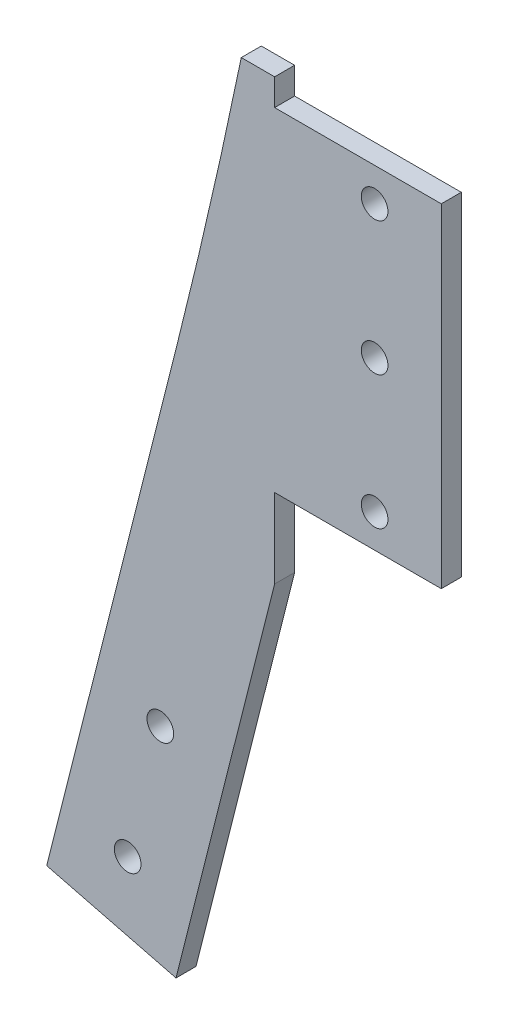
ISO-10303-21;
HEADER;
FILE_DESCRIPTION(('STEP AP214'),'2;1');
FILE_NAME('part.step','',(''),(''),'','','');
FILE_SCHEMA(('AUTOMOTIVE_DESIGN { 1 0 10303 214 1 1 1 1 }'));
ENDSEC;
DATA;
#1=APPLICATION_CONTEXT('core data for automotive mechanical design processes');
#2=APPLICATION_PROTOCOL_DEFINITION('international standard','automotive_design',2000,#1);
#3=PRODUCT_CONTEXT('',#1,'mechanical');
#4=PRODUCT('Part','Part','',(#3));
#5=PRODUCT_RELATED_PRODUCT_CATEGORY('part','',(#4));
#6=PRODUCT_DEFINITION_FORMATION('','',#4);
#7=PRODUCT_DEFINITION_CONTEXT('part definition',#1,'design');
#8=PRODUCT_DEFINITION('design','',#6,#7);
#9=PRODUCT_DEFINITION_SHAPE('','',#8);
#10=(LENGTH_UNIT() NAMED_UNIT(*) SI_UNIT(.MILLI.,.METRE.));
#11=(NAMED_UNIT(*) PLANE_ANGLE_UNIT() SI_UNIT($,.RADIAN.));
#12=(NAMED_UNIT(*) SI_UNIT($,.STERADIAN.) SOLID_ANGLE_UNIT());
#13=UNCERTAINTY_MEASURE_WITH_UNIT(LENGTH_MEASURE(1.E-05),#10,'distance_accuracy_value','');
#14=(GEOMETRIC_REPRESENTATION_CONTEXT(3) GLOBAL_UNCERTAINTY_ASSIGNED_CONTEXT((#13)) GLOBAL_UNIT_ASSIGNED_CONTEXT((#10,
#11,#12)) REPRESENTATION_CONTEXT('',''));
#15=CARTESIAN_POINT('',(0.,0.,0.));
#16=DIRECTION('',(0.,0.,1.));
#17=DIRECTION('',(1.,0.,0.));
#18=AXIS2_PLACEMENT_3D('',#15,#16,#17);
#19=CARTESIAN_POINT('',(-12.5150585075771,3.16036830999422,3.));
#20=DIRECTION('',(0.969563670871676,-0.244839310826181,0.));
#21=DIRECTION('',(0.244839310826181,0.969563670871677,0.));
#22=AXIS2_PLACEMENT_3D('',#19,#20,#21);
#23=PLANE('',#22);
#24=DIRECTION('',(-0.244839310826181,-0.969563670871677,0.));
#25=VECTOR('',#24,1.);
#26=CARTESIAN_POINT('',(-12.5150585075771,3.16036830999422,3.));
#27=LINE('',#26,#25);
#28=CARTESIAN_POINT('',(108.116259488817,480.860387575715,3.));
#29=VERTEX_POINT('',#28);
#30=CARTESIAN_POINT('',(88.8151541495192,404.428010432096,3.));
#31=VERTEX_POINT('',#30);
#32=EDGE_CURVE('E118',#29,#31,#27,.T.);
#33=ORIENTED_EDGE('',*,*,#32,.F.);
#34=DIRECTION('',(0.,0.,-1.));
#35=VECTOR('',#34,1.);
#36=CARTESIAN_POINT('',(108.116259488817,480.860387575715,3.));
#37=LINE('',#36,#35);
#38=CARTESIAN_POINT('',(108.116259488817,480.860387575715,0.));
#39=VERTEX_POINT('',#38);
#40=EDGE_CURVE('E134',#29,#39,#37,.T.);
#41=ORIENTED_EDGE('',*,*,#40,.T.);
#42=DIRECTION('',(-0.244839310826181,-0.969563670871677,0.));
#43=VECTOR('',#42,1.);
#44=CARTESIAN_POINT('',(-12.5150585075771,3.16036830999422,0.));
#45=LINE('',#44,#43);
#46=CARTESIAN_POINT('',(88.8151541495192,404.428010432096,0.));
#47=VERTEX_POINT('',#46);
#48=EDGE_CURVE('E131',#39,#47,#45,.T.);
#49=ORIENTED_EDGE('',*,*,#48,.T.);
#50=DIRECTION('',(0.,0.,-1.));
#51=VECTOR('',#50,1.);
#52=CARTESIAN_POINT('',(88.8151541495192,404.428010432096,3.));
#53=LINE('',#52,#51);
#54=EDGE_CURVE('E129',#31,#47,#53,.T.);
#55=ORIENTED_EDGE('',*,*,#54,.F.);
#56=EDGE_LOOP('',(#33,#41,#49,#55));
#57=FACE_BOUND('',#56,.T.);
#58=ADVANCED_FACE('F45',(#57),#23,.F.);
#59=CARTESIAN_POINT('',(101.330212657095,401.267642122102,3.));
#60=DIRECTION('',(0.244839310826178,0.969563670871677,0.));
#61=DIRECTION('',(-0.969563670871677,0.244839310826178,0.));
#62=AXIS2_PLACEMENT_3D('',#59,#60,#61);
#63=PLANE('',#62);
#64=DIRECTION('',(0.969563670871677,-0.244839310826178,0.));
#65=VECTOR('',#64,1.);
#66=CARTESIAN_POINT('',(101.330212657095,401.267642122102,0.));
#67=LINE('',#66,#65);
#68=CARTESIAN_POINT('',(108.206427566953,399.531224215573,0.));
#69=VERTEX_POINT('',#68);
#70=EDGE_CURVE('E176',#47,#69,#67,.T.);
#71=ORIENTED_EDGE('',*,*,#70,.T.);
#72=DIRECTION('',(0.,0.,-1.));
#73=VECTOR('',#72,1.);
#74=CARTESIAN_POINT('',(108.206427566953,399.531224215573,3.));
#75=LINE('',#74,#73);
#76=CARTESIAN_POINT('',(108.206427566953,399.531224215573,3.));
#77=VERTEX_POINT('',#76);
#78=EDGE_CURVE('E135',#77,#69,#75,.T.);
#79=ORIENTED_EDGE('',*,*,#78,.F.);
#80=DIRECTION('',(0.969563670871677,-0.244839310826178,0.));
#81=VECTOR('',#80,1.);
#82=CARTESIAN_POINT('',(101.330212657095,401.267642122102,3.));
#83=LINE('',#82,#81);
#84=EDGE_CURVE('E123',#31,#77,#83,.T.);
#85=ORIENTED_EDGE('',*,*,#84,.F.);
#86=ORIENTED_EDGE('',*,*,#54,.T.);
#87=EDGE_LOOP('',(#71,#79,#85,#86));
#88=FACE_BOUND('',#87,.T.);
#89=ADVANCED_FACE('F137',(#88),#63,.F.);
#90=CARTESIAN_POINT('',(6.8762149098565,-1.73641790652942,3.));
#91=DIRECTION('',(-0.969563670871677,0.24483931082618,0.));
#92=DIRECTION('',(-0.24483931082618,-0.969563670871677,0.));
#93=AXIS2_PLACEMENT_3D('',#90,#91,#92);
#94=PLANE('',#93);
#95=DIRECTION('',(0.24483931082618,0.969563670871677,0.));
#96=VECTOR('',#95,1.);
#97=CARTESIAN_POINT('',(6.8762149098565,-1.73641790652942,0.));
#98=LINE('',#97,#96);
#99=CARTESIAN_POINT('',(123.,458.113771050439,0.));
#100=VERTEX_POINT('',#99);
#101=EDGE_CURVE('E178',#69,#100,#98,.T.);
#102=ORIENTED_EDGE('',*,*,#101,.T.);
#103=DIRECTION('',(0.,0.,-1.));
#104=VECTOR('',#103,1.);
#105=CARTESIAN_POINT('',(123.,458.113771050439,3.));
#106=LINE('',#105,#104);
#107=CARTESIAN_POINT('',(123.,458.113771050439,3.));
#108=VERTEX_POINT('',#107);
#109=EDGE_CURVE('E224',#108,#100,#106,.T.);
#110=ORIENTED_EDGE('',*,*,#109,.F.);
#111=DIRECTION('',(0.24483931082618,0.969563670871677,0.));
#112=VECTOR('',#111,1.);
#113=CARTESIAN_POINT('',(6.8762149098565,-1.73641790652942,3.));
#114=LINE('',#113,#112);
#115=EDGE_CURVE('E140',#77,#108,#114,.T.);
#116=ORIENTED_EDGE('',*,*,#115,.F.);
#117=ORIENTED_EDGE('',*,*,#78,.T.);
#118=EDGE_LOOP('',(#102,#110,#116,#117));
#119=FACE_BOUND('',#118,.T.);
#120=ADVANCED_FACE('F246',(#119),#94,.F.);
#121=CARTESIAN_POINT('',(123.,0.,3.));
#122=DIRECTION('',(1.,0.,0.));
#123=DIRECTION('',(0.,0.,-1.));
#124=AXIS2_PLACEMENT_3D('',#121,#122,#123);
#125=PLANE('',#124);
#126=DIRECTION('',(0.,-1.,0.));
#127=VECTOR('',#126,1.);
#128=CARTESIAN_POINT('',(123.,0.,0.));
#129=LINE('',#128,#127);
#130=CARTESIAN_POINT('',(123.,470.,0.));
#131=VERTEX_POINT('',#130);
#132=EDGE_CURVE('E181',#131,#100,#129,.T.);
#133=ORIENTED_EDGE('',*,*,#132,.F.);
#134=DIRECTION('',(0.,0.,-1.));
#135=VECTOR('',#134,1.);
#136=CARTESIAN_POINT('',(123.,470.,3.));
#137=LINE('',#136,#135);
#138=CARTESIAN_POINT('',(123.,470.,3.));
#139=VERTEX_POINT('',#138);
#140=EDGE_CURVE('E222',#139,#131,#137,.T.);
#141=ORIENTED_EDGE('',*,*,#140,.F.);
#142=DIRECTION('',(0.,-1.,0.));
#143=VECTOR('',#142,1.);
#144=CARTESIAN_POINT('',(123.,0.,3.));
#145=LINE('',#144,#143);
#146=EDGE_CURVE('E142',#139,#108,#145,.T.);
#147=ORIENTED_EDGE('',*,*,#146,.T.);
#148=ORIENTED_EDGE('',*,*,#109,.T.);
#149=EDGE_LOOP('',(#133,#141,#147,#148));
#150=FACE_BOUND('',#149,.T.);
#151=ADVANCED_FACE('F251',(#150),#125,.T.);
#152=CARTESIAN_POINT('',(0.,470.,3.));
#153=DIRECTION('',(0.,-1.,0.));
#154=DIRECTION('',(0.,0.,-1.));
#155=AXIS2_PLACEMENT_3D('',#152,#153,#154);
#156=PLANE('',#155);
#157=DIRECTION('',(-1.,0.,0.));
#158=VECTOR('',#157,1.);
#159=CARTESIAN_POINT('',(0.,470.,0.));
#160=LINE('',#159,#158);
#161=CARTESIAN_POINT('',(148.,470.,0.));
#162=VERTEX_POINT('',#161);
#163=EDGE_CURVE('E184',#162,#131,#160,.T.);
#164=ORIENTED_EDGE('',*,*,#163,.F.);
#165=DIRECTION('',(0.,0.,-1.));
#166=VECTOR('',#165,1.);
#167=CARTESIAN_POINT('',(148.,470.,3.));
#168=LINE('',#167,#166);
#169=CARTESIAN_POINT('',(148.,470.,3.));
#170=VERTEX_POINT('',#169);
#171=EDGE_CURVE('E220',#170,#162,#168,.T.);
#172=ORIENTED_EDGE('',*,*,#171,.F.);
#173=DIRECTION('',(-1.,0.,0.));
#174=VECTOR('',#173,1.);
#175=CARTESIAN_POINT('',(0.,470.,3.));
#176=LINE('',#175,#174);
#177=EDGE_CURVE('E147',#170,#139,#176,.T.);
#178=ORIENTED_EDGE('',*,*,#177,.T.);
#179=ORIENTED_EDGE('',*,*,#140,.T.);
#180=EDGE_LOOP('',(#164,#172,#178,#179));
#181=FACE_BOUND('',#180,.T.);
#182=ADVANCED_FACE('F255',(#181),#156,.T.);
#183=CARTESIAN_POINT('',(148.,0.,3.));
#184=DIRECTION('',(-1.,0.,0.));
#185=DIRECTION('',(0.,-1.,0.));
#186=AXIS2_PLACEMENT_3D('',#183,#184,#185);
#187=PLANE('',#186);
#188=DIRECTION('',(0.,1.,0.));
#189=VECTOR('',#188,1.);
#190=CARTESIAN_POINT('',(148.,0.,0.));
#191=LINE('',#190,#189);
#192=CARTESIAN_POINT('',(148.,520.,0.));
#193=VERTEX_POINT('',#192);
#194=EDGE_CURVE('E187',#162,#193,#191,.T.);
#195=ORIENTED_EDGE('',*,*,#194,.T.);
#196=DIRECTION('',(0.,0.,-1.));
#197=VECTOR('',#196,1.);
#198=CARTESIAN_POINT('',(148.,520.,3.));
#199=LINE('',#198,#197);
#200=CARTESIAN_POINT('',(148.,520.,3.));
#201=VERTEX_POINT('',#200);
#202=EDGE_CURVE('E217',#201,#193,#199,.T.);
#203=ORIENTED_EDGE('',*,*,#202,.F.);
#204=DIRECTION('',(0.,1.,0.));
#205=VECTOR('',#204,1.);
#206=CARTESIAN_POINT('',(148.,0.,3.));
#207=LINE('',#206,#205);
#208=EDGE_CURVE('E150',#170,#201,#207,.T.);
#209=ORIENTED_EDGE('',*,*,#208,.F.);
#210=ORIENTED_EDGE('',*,*,#171,.T.);
#211=EDGE_LOOP('',(#195,#203,#209,#210));
#212=FACE_BOUND('',#211,.T.);
#213=ADVANCED_FACE('F259',(#212),#187,.F.);
#214=CARTESIAN_POINT('',(0.,520.,3.));
#215=DIRECTION('',(0.,-1.,0.));
#216=DIRECTION('',(0.,0.,-1.));
#217=AXIS2_PLACEMENT_3D('',#214,#215,#216);
#218=PLANE('',#217);
#219=DIRECTION('',(-1.,0.,0.));
#220=VECTOR('',#219,1.);
#221=CARTESIAN_POINT('',(0.,520.,0.));
#222=LINE('',#221,#220);
#223=CARTESIAN_POINT('',(123.,520.,0.));
#224=VERTEX_POINT('',#223);
#225=EDGE_CURVE('E189',#193,#224,#222,.T.);
#226=ORIENTED_EDGE('',*,*,#225,.T.);
#227=DIRECTION('',(0.,0.,-1.));
#228=VECTOR('',#227,1.);
#229=CARTESIAN_POINT('',(123.,520.,3.));
#230=LINE('',#229,#228);
#231=CARTESIAN_POINT('',(123.,520.,3.));
#232=VERTEX_POINT('',#231);
#233=EDGE_CURVE('E214',#232,#224,#230,.T.);
#234=ORIENTED_EDGE('',*,*,#233,.F.);
#235=DIRECTION('',(-1.,0.,0.));
#236=VECTOR('',#235,1.);
#237=CARTESIAN_POINT('',(0.,520.,3.));
#238=LINE('',#237,#236);
#239=EDGE_CURVE('E152',#201,#232,#238,.T.);
#240=ORIENTED_EDGE('',*,*,#239,.F.);
#241=ORIENTED_EDGE('',*,*,#202,.T.);
#242=EDGE_LOOP('',(#226,#234,#240,#241));
#243=FACE_BOUND('',#242,.T.);
#244=ADVANCED_FACE('F263',(#243),#218,.F.);
#245=CARTESIAN_POINT('',(123.,0.,3.));
#246=DIRECTION('',(-1.,0.,0.));
#247=DIRECTION('',(0.,0.,1.));
#248=AXIS2_PLACEMENT_3D('',#245,#246,#247);
#249=PLANE('',#248);
#250=DIRECTION('',(0.,1.,0.));
#251=VECTOR('',#250,1.);
#252=CARTESIAN_POINT('',(123.,0.,0.));
#253=LINE('',#252,#251);
#254=CARTESIAN_POINT('',(123.,524.,0.));
#255=VERTEX_POINT('',#254);
#256=EDGE_CURVE('E191',#224,#255,#253,.T.);
#257=ORIENTED_EDGE('',*,*,#256,.T.);
#258=DIRECTION('',(0.,0.,-1.));
#259=VECTOR('',#258,1.);
#260=CARTESIAN_POINT('',(123.,524.,3.));
#261=LINE('',#260,#259);
#262=CARTESIAN_POINT('',(123.,524.,3.));
#263=VERTEX_POINT('',#262);
#264=EDGE_CURVE('E212',#263,#255,#261,.T.);
#265=ORIENTED_EDGE('',*,*,#264,.F.);
#266=DIRECTION('',(0.,1.,0.));
#267=VECTOR('',#266,1.);
#268=CARTESIAN_POINT('',(123.,0.,3.));
#269=LINE('',#268,#267);
#270=EDGE_CURVE('E154',#232,#263,#269,.T.);
#271=ORIENTED_EDGE('',*,*,#270,.F.);
#272=ORIENTED_EDGE('',*,*,#233,.T.);
#273=EDGE_LOOP('',(#257,#265,#271,#272));
#274=FACE_BOUND('',#273,.T.);
#275=ADVANCED_FACE('F267',(#274),#249,.F.);
#276=CARTESIAN_POINT('',(105.855970183021,431.066527449985,3.));
#277=DIRECTION('',(0.,0.,-1.));
#278=DIRECTION('',(-1.,0.,0.));
#279=AXIS2_PLACEMENT_3D('',#276,#277,#278);
#280=CYLINDRICAL_SURFACE('',#279,1.99999999999985);
#281=CARTESIAN_POINT('',(105.855970183021,431.066527449985,3.));
#282=DIRECTION('',(0.,0.,1.));
#283=DIRECTION('',(1.,0.,0.));
#284=AXIS2_PLACEMENT_3D('',#281,#282,#283);
#285=CIRCLE('',#284,1.99999999999985);
#286=CARTESIAN_POINT('',(107.855970183021,431.066527449985,3.));
#287=VERTEX_POINT('',#286);
#288=EDGE_CURVE('E168',#287,#287,#285,.T.);
#289=ORIENTED_EDGE('',*,*,#288,.T.);
#290=EDGE_LOOP('',(#289));
#291=FACE_BOUND('',#290,.T.);
#292=CARTESIAN_POINT('',(105.855970183021,431.066527449985,0.));
#293=DIRECTION('',(0.,0.,1.));
#294=DIRECTION('',(1.,0.,0.));
#295=AXIS2_PLACEMENT_3D('',#292,#293,#294);
#296=CIRCLE('',#295,1.99999999999985);
#297=CARTESIAN_POINT('',(107.855970183021,431.066527449985,0.));
#298=VERTEX_POINT('',#297);
#299=EDGE_CURVE('E206',#298,#298,#296,.T.);
#300=ORIENTED_EDGE('',*,*,#299,.F.);
#301=EDGE_LOOP('',(#300));
#302=FACE_BOUND('',#301,.T.);
#303=ADVANCED_FACE('F271',(#291,#302),#280,.F.);
#304=CARTESIAN_POINT('',(138.,475.,3.));
#305=DIRECTION('',(0.,0.,-1.));
#306=DIRECTION('',(-1.,0.,0.));
#307=AXIS2_PLACEMENT_3D('',#304,#305,#306);
#308=CYLINDRICAL_SURFACE('',#307,2.);
#309=CARTESIAN_POINT('',(138.,475.,3.));
#310=DIRECTION('',(0.,0.,1.));
#311=DIRECTION('',(1.,0.,0.));
#312=AXIS2_PLACEMENT_3D('',#309,#310,#311);
#313=CIRCLE('',#312,2.);
#314=CARTESIAN_POINT('',(140.,475.,3.));
#315=VERTEX_POINT('',#314);
#316=EDGE_CURVE('E165',#315,#315,#313,.T.);
#317=ORIENTED_EDGE('',*,*,#316,.T.);
#318=EDGE_LOOP('',(#317));
#319=FACE_BOUND('',#318,.T.);
#320=CARTESIAN_POINT('',(138.,475.,0.));
#321=DIRECTION('',(0.,0.,1.));
#322=DIRECTION('',(1.,0.,0.));
#323=AXIS2_PLACEMENT_3D('',#320,#321,#322);
#324=CIRCLE('',#323,2.);
#325=CARTESIAN_POINT('',(140.,475.,0.));
#326=VERTEX_POINT('',#325);
#327=EDGE_CURVE('E203',#326,#326,#324,.T.);
#328=ORIENTED_EDGE('',*,*,#327,.F.);
#329=EDGE_LOOP('',(#328));
#330=FACE_BOUND('',#329,.T.);
#331=ADVANCED_FACE('F282',(#319,#330),#308,.F.);
#332=CARTESIAN_POINT('',(138.,515.,3.));
#333=DIRECTION('',(0.,0.,-1.));
#334=DIRECTION('',(-1.,0.,0.));
#335=AXIS2_PLACEMENT_3D('',#332,#333,#334);
#336=CYLINDRICAL_SURFACE('',#335,2.);
#337=CARTESIAN_POINT('',(138.,515.,3.));
#338=DIRECTION('',(0.,0.,1.));
#339=DIRECTION('',(1.,0.,0.));
#340=AXIS2_PLACEMENT_3D('',#337,#338,#339);
#341=CIRCLE('',#340,2.);
#342=CARTESIAN_POINT('',(140.,515.,3.));
#343=VERTEX_POINT('',#342);
#344=EDGE_CURVE('E162',#343,#343,#341,.T.);
#345=ORIENTED_EDGE('',*,*,#344,.T.);
#346=EDGE_LOOP('',(#345));
#347=FACE_BOUND('',#346,.T.);
#348=CARTESIAN_POINT('',(138.,515.,0.));
#349=DIRECTION('',(0.,0.,1.));
#350=DIRECTION('',(1.,0.,0.));
#351=AXIS2_PLACEMENT_3D('',#348,#349,#350);
#352=CIRCLE('',#351,2.);
#353=CARTESIAN_POINT('',(140.,515.,0.));
#354=VERTEX_POINT('',#353);
#355=EDGE_CURVE('E200',#354,#354,#352,.T.);
#356=ORIENTED_EDGE('',*,*,#355,.F.);
#357=EDGE_LOOP('',(#356));
#358=FACE_BOUND('',#357,.T.);
#359=ADVANCED_FACE('F278',(#347,#358),#336,.F.);
#360=CARTESIAN_POINT('',(138.,495.,3.));
#361=DIRECTION('',(0.,0.,-1.));
#362=DIRECTION('',(-1.,0.,0.));
#363=AXIS2_PLACEMENT_3D('',#360,#361,#362);
#364=CYLINDRICAL_SURFACE('',#363,2.);
#365=CARTESIAN_POINT('',(138.,495.,3.));
#366=DIRECTION('',(0.,0.,1.));
#367=DIRECTION('',(1.,0.,0.));
#368=AXIS2_PLACEMENT_3D('',#365,#366,#367);
#369=CIRCLE('',#368,2.);
#370=CARTESIAN_POINT('',(140.,495.,3.));
#371=VERTEX_POINT('',#370);
#372=EDGE_CURVE('E159',#371,#371,#369,.T.);
#373=ORIENTED_EDGE('',*,*,#372,.T.);
#374=EDGE_LOOP('',(#373));
#375=FACE_BOUND('',#374,.T.);
#376=CARTESIAN_POINT('',(138.,495.,0.));
#377=DIRECTION('',(0.,0.,1.));
#378=DIRECTION('',(1.,0.,0.));
#379=AXIS2_PLACEMENT_3D('',#376,#377,#378);
#380=CIRCLE('',#379,2.);
#381=CARTESIAN_POINT('',(140.,495.,0.));
#382=VERTEX_POINT('',#381);
#383=EDGE_CURVE('E197',#382,#382,#380,.T.);
#384=ORIENTED_EDGE('',*,*,#383,.F.);
#385=EDGE_LOOP('',(#384));
#386=FACE_BOUND('',#385,.T.);
#387=ADVANCED_FACE('F275',(#375,#386),#364,.F.);
#388=CARTESIAN_POINT('',(0.,524.,3.));
#389=DIRECTION('',(0.,1.,0.));
#390=DIRECTION('',(0.,0.,1.));
#391=AXIS2_PLACEMENT_3D('',#388,#389,#390);
#392=PLANE('',#391);
#393=DIRECTION('',(1.,0.,0.));
#394=VECTOR('',#393,1.);
#395=CARTESIAN_POINT('',(0.,524.,0.));
#396=LINE('',#395,#394);
#397=CARTESIAN_POINT('',(118.,524.,0.));
#398=VERTEX_POINT('',#397);
#399=EDGE_CURVE('E194',#398,#255,#396,.T.);
#400=ORIENTED_EDGE('',*,*,#399,.F.);
#401=DIRECTION('',(0.,0.,-1.));
#402=VECTOR('',#401,1.);
#403=CARTESIAN_POINT('',(118.,524.,3.));
#404=LINE('',#403,#402);
#405=CARTESIAN_POINT('',(118.,524.,3.));
#406=VERTEX_POINT('',#405);
#407=EDGE_CURVE('E174',#406,#398,#404,.T.);
#408=ORIENTED_EDGE('',*,*,#407,.F.);
#409=DIRECTION('',(1.,0.,0.));
#410=VECTOR('',#409,1.);
#411=CARTESIAN_POINT('',(0.,524.,3.));
#412=LINE('',#411,#410);
#413=EDGE_CURVE('E156',#406,#263,#412,.T.);
#414=ORIENTED_EDGE('',*,*,#413,.T.);
#415=ORIENTED_EDGE('',*,*,#264,.T.);
#416=EDGE_LOOP('',(#400,#408,#414,#415));
#417=FACE_BOUND('',#416,.T.);
#418=ADVANCED_FACE('F233',(#417),#392,.T.);
#419=CARTESIAN_POINT('',(100.959183966498,411.675254032551,3.));
#420=DIRECTION('',(0.,0.,-1.));
#421=DIRECTION('',(-1.,0.,0.));
#422=AXIS2_PLACEMENT_3D('',#419,#420,#421);
#423=CYLINDRICAL_SURFACE('',#422,1.99999999999994);
#424=CARTESIAN_POINT('',(100.959183966498,411.675254032551,3.));
#425=DIRECTION('',(0.,0.,1.));
#426=DIRECTION('',(1.,0.,0.));
#427=AXIS2_PLACEMENT_3D('',#424,#425,#426);
#428=CIRCLE('',#427,1.99999999999994);
#429=CARTESIAN_POINT('',(102.959183966498,411.675254032551,3.));
#430=VERTEX_POINT('',#429);
#431=EDGE_CURVE('E171',#430,#430,#428,.T.);
#432=ORIENTED_EDGE('',*,*,#431,.T.);
#433=EDGE_LOOP('',(#432));
#434=FACE_BOUND('',#433,.T.);
#435=CARTESIAN_POINT('',(100.959183966498,411.675254032551,0.));
#436=DIRECTION('',(0.,0.,1.));
#437=DIRECTION('',(1.,0.,0.));
#438=AXIS2_PLACEMENT_3D('',#435,#436,#437);
#439=CIRCLE('',#438,1.99999999999994);
#440=CARTESIAN_POINT('',(102.959183966498,411.675254032551,0.));
#441=VERTEX_POINT('',#440);
#442=EDGE_CURVE('E126',#441,#441,#439,.T.);
#443=ORIENTED_EDGE('',*,*,#442,.F.);
#444=EDGE_LOOP('',(#443));
#445=FACE_BOUND('',#444,.T.);
#446=ADVANCED_FACE('F274',(#434,#445),#423,.F.);
#447=CARTESIAN_POINT('',(0.,0.,3.));
#448=DIRECTION('',(0.,0.,1.));
#449=DIRECTION('',(1.,0.,0.));
#450=AXIS2_PLACEMENT_3D('',#447,#448,#449);
#451=PLANE('',#450);
#452=ORIENTED_EDGE('',*,*,#413,.F.);
#453=CARTESIAN_POINT('',(-861.44741138286,725.699698401895,3.));
#454=DIRECTION('',(0.,0.,1.));
#455=DIRECTION('',(1.,0.,0.));
#456=AXIS2_PLACEMENT_3D('',#453,#454,#455);
#457=CIRCLE('',#456,1000.);
#458=EDGE_CURVE('E11',#406,#29,#457,.F.);
#459=ORIENTED_EDGE('',*,*,#458,.T.);
#460=ORIENTED_EDGE('',*,*,#32,.T.);
#461=ORIENTED_EDGE('',*,*,#84,.T.);
#462=ORIENTED_EDGE('',*,*,#115,.T.);
#463=ORIENTED_EDGE('',*,*,#146,.F.);
#464=ORIENTED_EDGE('',*,*,#177,.F.);
#465=ORIENTED_EDGE('',*,*,#208,.T.);
#466=ORIENTED_EDGE('',*,*,#239,.T.);
#467=ORIENTED_EDGE('',*,*,#270,.T.);
#468=EDGE_LOOP('',(#452,#459,#460,#461,#462,#463,#464,#465,#466,#467));
#469=FACE_BOUND('',#468,.T.);
#470=ORIENTED_EDGE('',*,*,#372,.F.);
#471=EDGE_LOOP('',(#470));
#472=FACE_BOUND('',#471,.T.);
#473=ORIENTED_EDGE('',*,*,#344,.F.);
#474=EDGE_LOOP('',(#473));
#475=FACE_BOUND('',#474,.T.);
#476=ORIENTED_EDGE('',*,*,#316,.F.);
#477=EDGE_LOOP('',(#476));
#478=FACE_BOUND('',#477,.T.);
#479=ORIENTED_EDGE('',*,*,#288,.F.);
#480=EDGE_LOOP('',(#479));
#481=FACE_BOUND('',#480,.T.);
#482=ORIENTED_EDGE('',*,*,#431,.F.);
#483=EDGE_LOOP('',(#482));
#484=FACE_BOUND('',#483,.T.);
#485=ADVANCED_FACE('F120',(#469,#472,#475,#478,#481,#484),#451,.T.);
#486=CARTESIAN_POINT('',(0.,0.,0.));
#487=DIRECTION('',(0.,0.,1.));
#488=DIRECTION('',(1.,0.,0.));
#489=AXIS2_PLACEMENT_3D('',#486,#487,#488);
#490=PLANE('',#489);
#491=ORIENTED_EDGE('',*,*,#48,.F.);
#492=CARTESIAN_POINT('',(-861.44741138286,725.699698401895,0.));
#493=DIRECTION('',(0.,0.,1.));
#494=DIRECTION('',(1.,0.,0.));
#495=AXIS2_PLACEMENT_3D('',#492,#493,#494);
#496=CIRCLE('',#495,1000.);
#497=EDGE_CURVE('E53',#39,#398,#496,.T.);
#498=ORIENTED_EDGE('',*,*,#497,.T.);
#499=ORIENTED_EDGE('',*,*,#399,.T.);
#500=ORIENTED_EDGE('',*,*,#256,.F.);
#501=ORIENTED_EDGE('',*,*,#225,.F.);
#502=ORIENTED_EDGE('',*,*,#194,.F.);
#503=ORIENTED_EDGE('',*,*,#163,.T.);
#504=ORIENTED_EDGE('',*,*,#132,.T.);
#505=ORIENTED_EDGE('',*,*,#101,.F.);
#506=ORIENTED_EDGE('',*,*,#70,.F.);
#507=EDGE_LOOP('',(#491,#498,#499,#500,#501,#502,#503,#504,#505,#506));
#508=FACE_BOUND('',#507,.T.);
#509=ORIENTED_EDGE('',*,*,#383,.T.);
#510=EDGE_LOOP('',(#509));
#511=FACE_BOUND('',#510,.T.);
#512=ORIENTED_EDGE('',*,*,#355,.T.);
#513=EDGE_LOOP('',(#512));
#514=FACE_BOUND('',#513,.T.);
#515=ORIENTED_EDGE('',*,*,#327,.T.);
#516=EDGE_LOOP('',(#515));
#517=FACE_BOUND('',#516,.T.);
#518=ORIENTED_EDGE('',*,*,#299,.T.);
#519=EDGE_LOOP('',(#518));
#520=FACE_BOUND('',#519,.T.);
#521=ORIENTED_EDGE('',*,*,#442,.T.);
#522=EDGE_LOOP('',(#521));
#523=FACE_BOUND('',#522,.T.);
#524=ADVANCED_FACE('F229',(#508,#511,#514,#517,#520,#523),#490,.F.);
#525=CARTESIAN_POINT('',(-861.44741138286,725.699698401895,3.));
#526=DIRECTION('',(0.,0.,-1.));
#527=DIRECTION('',(-1.,0.,0.));
#528=AXIS2_PLACEMENT_3D('',#525,#526,#527);
#529=CYLINDRICAL_SURFACE('',#528,1000.);
#530=ORIENTED_EDGE('',*,*,#458,.F.);
#531=ORIENTED_EDGE('',*,*,#407,.T.);
#532=ORIENTED_EDGE('',*,*,#497,.F.);
#533=ORIENTED_EDGE('',*,*,#40,.F.);
#534=EDGE_LOOP('',(#530,#531,#532,#533));
#535=FACE_BOUND('',#534,.T.);
#536=ADVANCED_FACE('F47',(#535),#529,.F.);
#537=CLOSED_SHELL('',(#58,#89,#120,#151,#182,#213,#244,#275,#303,#331,#359,#387,#418,#446,#485,
#524,#536));
#538=MANIFOLD_SOLID_BREP('B2',#537);
#539=ADVANCED_BREP_SHAPE_REPRESENTATION('',(#18,#538),#14);
#540=SHAPE_DEFINITION_REPRESENTATION(#9,#539);
ENDSEC;
END-ISO-10303-21;
